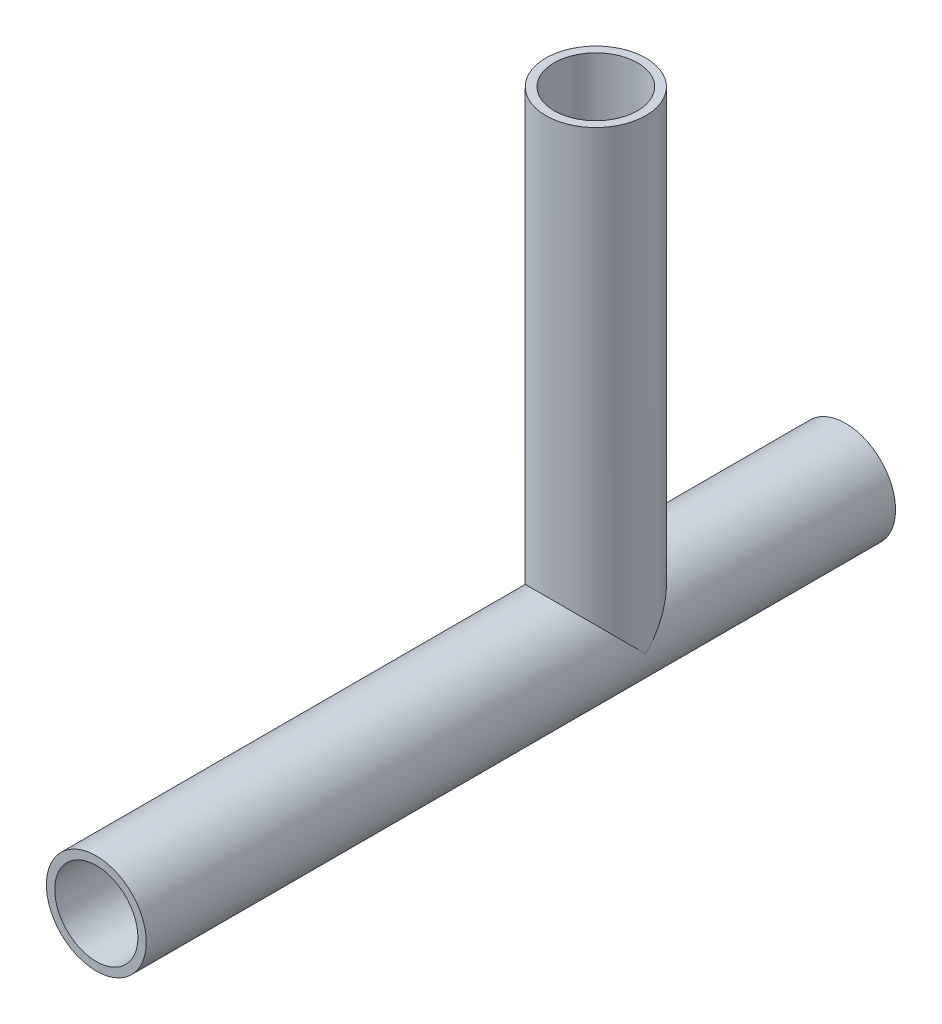
ISO-10303-21;
HEADER;
FILE_DESCRIPTION(('STEP AP214'),'2;1');
FILE_NAME('part.step','',(''),(''),'','','');
FILE_SCHEMA(('AUTOMOTIVE_DESIGN { 1 0 10303 214 1 1 1 1 }'));
ENDSEC;
DATA;
#1=APPLICATION_CONTEXT('core data for automotive mechanical design processes');
#2=APPLICATION_PROTOCOL_DEFINITION('international standard','automotive_design',2000,#1);
#3=PRODUCT_CONTEXT('',#1,'mechanical');
#4=PRODUCT('Part','Part','',(#3));
#5=PRODUCT_RELATED_PRODUCT_CATEGORY('part','',(#4));
#6=PRODUCT_DEFINITION_FORMATION('','',#4);
#7=PRODUCT_DEFINITION_CONTEXT('part definition',#1,'design');
#8=PRODUCT_DEFINITION('design','',#6,#7);
#9=PRODUCT_DEFINITION_SHAPE('','',#8);
#10=(LENGTH_UNIT() NAMED_UNIT(*) SI_UNIT(.MILLI.,.METRE.));
#11=(NAMED_UNIT(*) PLANE_ANGLE_UNIT() SI_UNIT($,.RADIAN.));
#12=(NAMED_UNIT(*) SI_UNIT($,.STERADIAN.) SOLID_ANGLE_UNIT());
#13=UNCERTAINTY_MEASURE_WITH_UNIT(LENGTH_MEASURE(1.E-05),#10,'distance_accuracy_value','');
#14=(GEOMETRIC_REPRESENTATION_CONTEXT(3) GLOBAL_UNCERTAINTY_ASSIGNED_CONTEXT((#13)) GLOBAL_UNIT_ASSIGNED_CONTEXT((#10,
#11,#12)) REPRESENTATION_CONTEXT('',''));
#15=CARTESIAN_POINT('',(0.,0.,0.));
#16=DIRECTION('',(0.,0.,1.));
#17=DIRECTION('',(1.,0.,0.));
#18=AXIS2_PLACEMENT_3D('',#15,#16,#17);
#19=CARTESIAN_POINT('',(0.,0.,-15.));
#20=DIRECTION('',(0.,0.,1.));
#21=DIRECTION('',(1.,0.,0.));
#22=AXIS2_PLACEMENT_3D('',#19,#20,#21);
#23=CYLINDRICAL_SURFACE('',#22,3.);
#24=CARTESIAN_POINT('',(0.,0.,-15.));
#25=DIRECTION('',(0.,0.,1.));
#26=DIRECTION('',(1.,0.,0.));
#27=AXIS2_PLACEMENT_3D('',#24,#25,#26);
#28=CIRCLE('',#27,3.);
#29=CARTESIAN_POINT('',(3.,0.,-15.));
#30=VERTEX_POINT('',#29);
#31=EDGE_CURVE('E185',#30,#30,#28,.T.);
#32=ORIENTED_EDGE('',*,*,#31,.T.);
#33=EDGE_LOOP('',(#32));
#34=FACE_BOUND('',#33,.T.);
#35=CARTESIAN_POINT('',(0.,0.,30.));
#36=DIRECTION('',(0.,0.,1.));
#37=DIRECTION('',(1.,0.,0.));
#38=AXIS2_PLACEMENT_3D('',#35,#36,#37);
#39=CIRCLE('',#38,3.);
#40=CARTESIAN_POINT('',(3.,0.,30.));
#41=VERTEX_POINT('',#40);
#42=EDGE_CURVE('E191',#41,#41,#39,.T.);
#43=ORIENTED_EDGE('',*,*,#42,.F.);
#44=EDGE_LOOP('',(#43));
#45=FACE_BOUND('',#44,.T.);
#46=CARTESIAN_POINT('',(0.,0.,0.));
#47=DIRECTION('',(0.,0.707106781186547,0.707106781186547));
#48=DIRECTION('',(0.,-0.707106781186547,0.707106781186547));
#49=AXIS2_PLACEMENT_3D('',#46,#47,#48);
#50=ELLIPSE('',#49,4.24264068711929,3.);
#51=CARTESIAN_POINT('',(-3.,0.,0.));
#52=VERTEX_POINT('',#51);
#53=CARTESIAN_POINT('',(3.,0.,0.));
#54=VERTEX_POINT('',#53);
#55=EDGE_CURVE('E102',#52,#54,#50,.F.);
#56=ORIENTED_EDGE('',*,*,#55,.T.);
#57=CARTESIAN_POINT('',(0.,0.,0.));
#58=DIRECTION('',(0.,-0.707106781186547,0.707106781186547));
#59=DIRECTION('',(0.,0.707106781186547,0.707106781186547));
#60=AXIS2_PLACEMENT_3D('',#57,#58,#59);
#61=ELLIPSE('',#60,4.24264068711929,3.);
#62=EDGE_CURVE('E196',#54,#52,#61,.T.);
#63=ORIENTED_EDGE('',*,*,#62,.T.);
#64=EDGE_LOOP('',(#56,#63));
#65=FACE_BOUND('',#64,.T.);
#66=ADVANCED_FACE('F37',(#34,#45,#65),#23,.T.);
#67=CARTESIAN_POINT('',(0.,0.,-15.));
#68=DIRECTION('',(0.,0.,1.));
#69=DIRECTION('',(1.,0.,0.));
#70=AXIS2_PLACEMENT_3D('',#67,#68,#69);
#71=CYLINDRICAL_SURFACE('',#70,2.5);
#72=CARTESIAN_POINT('',(0.,0.,30.));
#73=DIRECTION('',(0.,0.,1.));
#74=DIRECTION('',(1.,0.,0.));
#75=AXIS2_PLACEMENT_3D('',#72,#73,#74);
#76=CIRCLE('',#75,2.5);
#77=CARTESIAN_POINT('',(2.5,0.,30.));
#78=VERTEX_POINT('',#77);
#79=EDGE_CURVE('E194',#78,#78,#76,.T.);
#80=ORIENTED_EDGE('',*,*,#79,.T.);
#81=EDGE_LOOP('',(#80));
#82=FACE_BOUND('',#81,.T.);
#83=CARTESIAN_POINT('',(0.,0.,-15.));
#84=DIRECTION('',(0.,0.,1.));
#85=DIRECTION('',(1.,0.,0.));
#86=AXIS2_PLACEMENT_3D('',#83,#84,#85);
#87=CIRCLE('',#86,2.5);
#88=CARTESIAN_POINT('',(2.5,0.,-15.));
#89=VERTEX_POINT('',#88);
#90=EDGE_CURVE('E187',#89,#89,#87,.T.);
#91=ORIENTED_EDGE('',*,*,#90,.F.);
#92=EDGE_LOOP('',(#91));
#93=FACE_BOUND('',#92,.T.);
#94=DIRECTION('',(0.,0.,1.));
#95=VECTOR('',#94,1.);
#96=CARTESIAN_POINT('',(-2.5,0.,-15.));
#97=LINE('',#96,#95);
#98=CARTESIAN_POINT('',(-2.5,0.,1.6583123951777));
#99=VERTEX_POINT('',#98);
#100=CARTESIAN_POINT('',(-2.5,0.,0.));
#101=VERTEX_POINT('',#100);
#102=EDGE_CURVE('E53',#99,#101,#97,.F.);
#103=ORIENTED_EDGE('',*,*,#102,.F.);
#104=CARTESIAN_POINT('',(2.5,0.,1.6583123951777));
#105=CARTESIAN_POINT('',(2.50001053689097,0.0446676190961174,1.65828023930748));
#106=CARTESIAN_POINT('',(2.4988033626358,0.0893146756582219,1.6601162772629));
#107=CARTESIAN_POINT('',(2.49403945424107,0.178118808574985,1.66727317263237));
#108=CARTESIAN_POINT('',(2.49048724961452,0.222276662984987,1.6725873117957));
#109=CARTESIAN_POINT('',(2.48118723003889,0.309186552805187,1.68634898291668));
#110=CARTESIAN_POINT('',(2.47547237004126,0.351949707497475,1.69474943169534));
#111=CARTESIAN_POINT('',(2.46196831278083,0.436516845554949,1.71430901873713));
#112=CARTESIAN_POINT('',(2.4541779670438,0.478320283905698,1.72546968412582));
#113=CARTESIAN_POINT('',(2.42094569151119,0.634726425048235,1.77222694334976));
#114=CARTESIAN_POINT('',(2.38888265367656,0.745590990119838,1.81578246635464));
#115=CARTESIAN_POINT('',(2.31170305357439,0.958667215286052,1.91309058631365));
#116=CARTESIAN_POINT('',(2.26647787223489,1.06079733200858,1.96692669689499));
#117=CARTESIAN_POINT('',(2.17845139252837,1.22908717969094,2.06333806009316));
#118=CARTESIAN_POINT('',(2.13847839662809,1.2973472734266,2.10487744088079));
#119=CARTESIAN_POINT('',(2.05253160808425,1.42945216003762,2.18877312173696));
#120=CARTESIAN_POINT('',(2.00655528279991,1.49329507193548,2.23112976012053));
#121=CARTESIAN_POINT('',(1.85992335660289,1.67790046606017,2.3573792706994));
#122=CARTESIAN_POINT('',(1.75032166679402,1.79220223726546,2.4407338586886));
#123=CARTESIAN_POINT('',(1.53332316028444,1.9785848485795,2.5810766365136));
#124=CARTESIAN_POINT('',(1.43037180448632,2.05448117836856,2.63991085386502));
#125=CARTESIAN_POINT('',(1.21029935284124,2.19132333858638,2.74774689794262));
#126=CARTESIAN_POINT('',(1.09319843428571,2.25229009148164,2.79676246687922));
#127=CARTESIAN_POINT('',(0.867928883305876,2.3471135832324,2.87372981565162));
#128=CARTESIAN_POINT('',(0.761717046456604,2.38383517864742,2.90385830152503));
#129=CARTESIAN_POINT('',(0.542830448073846,2.44298114981978,2.95260444248338));
#130=CARTESIAN_POINT('',(0.430159668824189,2.46541423403497,2.9712291086228));
#131=CARTESIAN_POINT('',(0.200906226670691,2.49460149180071,2.99549159829453));
#132=CARTESIAN_POINT('',(0.0843091977674733,2.50128982658613,3.00107488681869));
#133=CARTESIAN_POINT('',(-0.148527340090233,2.49829775944192,2.99858143920542));
#134=CARTESIAN_POINT('',(-0.264766856743925,2.48861771252143,2.99050499932994));
#135=CARTESIAN_POINT('',(-0.485445759029511,2.45478579221322,2.96241339443721));
#136=CARTESIAN_POINT('',(-0.590153469719584,2.43164900062191,2.94323604357123));
#137=CARTESIAN_POINT('',(-0.793625750717623,2.37305235039454,2.89501327215416));
#138=CARTESIAN_POINT('',(-0.892389435591339,2.3375906611205,2.86596638567855));
#139=CARTESIAN_POINT('',(-1.09053416369652,2.25240860554024,2.79690287446883));
#140=CARTESIAN_POINT('',(-1.18924473934221,2.20172771983302,2.7561602110168));
#141=CARTESIAN_POINT('',(-1.3767800718126,2.08960269254213,2.66744714285834));
#142=CARTESIAN_POINT('',(-1.46559592577916,2.02814898391747,2.61947031903863));
#143=CARTESIAN_POINT('',(-1.67280362441445,1.86454080960494,2.49448801107939));
#144=CARTESIAN_POINT('',(-1.78517382835747,1.75692904106797,2.41452810108692));
#145=CARTESIAN_POINT('',(-1.93670155603639,1.58276013263235,2.29203972156859));
#146=CARTESIAN_POINT('',(-1.98442714978062,1.5224861962744,2.25072647403067));
#147=CARTESIAN_POINT('',(-2.07418686478911,1.39772822879842,2.16828385513607));
#148=CARTESIAN_POINT('',(-2.11622304065682,1.33324573004271,2.12715442261523));
#149=CARTESIAN_POINT('',(-2.21282190384309,1.16889290959051,2.02736668216148));
#150=CARTESIAN_POINT('',(-2.26406445132992,1.06656162182183,1.96949413582953));
#151=CARTESIAN_POINT('',(-2.35313154217164,0.852162280933765,1.86215058777702));
#152=CARTESIAN_POINT('',(-2.39099119237604,0.740120677710073,1.81265778441367));
#153=CARTESIAN_POINT('',(-2.44187928159532,0.542368123492129,1.7431252104005));
#154=CARTESIAN_POINT('',(-2.45896760338397,0.459278569532453,1.71871174214238));
#155=CARTESIAN_POINT('',(-2.48466533863309,0.289382777852356,1.68136078058063));
#156=CARTESIAN_POINT('',(-2.49330657445815,0.202591784872558,1.66838023493806));
#157=CARTESIAN_POINT('',(-2.49822814088172,0.0960725270432523,1.66098011654761));
#158=CARTESIAN_POINT('',(-2.49889195042314,0.0768814878014956,1.65998140373826));
#159=CARTESIAN_POINT('',(-2.49977745262101,0.0384623376736721,1.65864846758548));
#160=CARTESIAN_POINT('',(-2.49999905762164,0.0192342201937472,1.65831437598636));
#161=CARTESIAN_POINT('',(-2.5,0.,1.6583123951777));
#162=B_SPLINE_CURVE_WITH_KNOTS('',3,(#104,#105,#106,#107,#108,#109,#110,#111,#112,#113,#114,
#115,#116,#117,#118,#119,#120,#121,#122,#123,#124,#125,#126,#127,#128,#129,#130,#131,#132,#133,
#134,#135,#136,#137,#138,#139,#140,#141,#142,#143,#144,#145,#146,#147,#148,#149,#150,#151,#152,
#153,#154,#155,#156,#157,#158,#159,#160,#161),.UNSPECIFIED.,.F.,.F.,(4,2,2,2,2,2,2,2,2,2,2,2,2,
2,2,2,2,2,2,2,2,2,2,2,2,2,2,2,4),(0.,0.133915809511517,0.267573709534376,0.399271959248702,
0.531043236367036,0.898867426511474,1.26981755381915,1.53753000139769,1.8053557566704,
2.33924592067388,2.76010881123972,3.18037848070633,3.5279765341575,3.87536253284724,
4.22419861170398,4.57302712485181,4.89843954153485,5.22390031294721,5.57721326116425,
5.93084158108767,6.45264424433967,6.71427180911986,6.97580463953596,7.35949670871461,
7.74217465007991,8.00607441227289,8.26897611958203,8.32665105551862,8.38433742291033),.UNSPECIFIED.);
#163=CARTESIAN_POINT('',(2.5,0.,1.6583123951777));
#164=VERTEX_POINT('',#163);
#165=EDGE_CURVE('E42',#164,#99,#162,.T.);
#166=ORIENTED_EDGE('',*,*,#165,.F.);
#167=DIRECTION('',(0.,0.,1.));
#168=VECTOR('',#167,1.);
#169=CARTESIAN_POINT('',(2.5,0.,-15.));
#170=LINE('',#169,#168);
#171=CARTESIAN_POINT('',(2.5,0.,0.));
#172=VERTEX_POINT('',#171);
#173=EDGE_CURVE('E61',#172,#164,#170,.T.);
#174=ORIENTED_EDGE('',*,*,#173,.F.);
#175=CARTESIAN_POINT('',(2.5,0.,-1.6583123951777));
#176=VERTEX_POINT('',#175);
#177=EDGE_CURVE('E84',#176,#172,#170,.T.);
#178=ORIENTED_EDGE('',*,*,#177,.F.);
#179=CARTESIAN_POINT('',(-2.5,0.,-1.6583123951777));
#180=CARTESIAN_POINT('',(-2.50001053689097,0.0446676190961174,-1.65828023930748));
#181=CARTESIAN_POINT('',(-2.4988033626358,0.0893146756582219,-1.6601162772629));
#182=CARTESIAN_POINT('',(-2.49403945424107,0.178118808574985,-1.66727317263237));
#183=CARTESIAN_POINT('',(-2.49048724961452,0.222276662984987,-1.6725873117957));
#184=CARTESIAN_POINT('',(-2.48118723003889,0.309186552805187,-1.68634898291668));
#185=CARTESIAN_POINT('',(-2.47547237004126,0.351949707497475,-1.69474943169534));
#186=CARTESIAN_POINT('',(-2.46196831278083,0.436516845554949,-1.71430901873713));
#187=CARTESIAN_POINT('',(-2.4541779670438,0.478320283905698,-1.72546968412582));
#188=CARTESIAN_POINT('',(-2.42094569151119,0.634726425048235,-1.77222694334976));
#189=CARTESIAN_POINT('',(-2.38888265367656,0.745590990119838,-1.81578246635464));
#190=CARTESIAN_POINT('',(-2.31170305357439,0.958667215286052,-1.91309058631365));
#191=CARTESIAN_POINT('',(-2.26647787223489,1.06079733200858,-1.96692669689499));
#192=CARTESIAN_POINT('',(-2.17845139252837,1.22908717969094,-2.06333806009316));
#193=CARTESIAN_POINT('',(-2.13847839662809,1.2973472734266,-2.10487744088079));
#194=CARTESIAN_POINT('',(-2.05253160808425,1.42945216003762,-2.18877312173696));
#195=CARTESIAN_POINT('',(-2.00655528279991,1.49329507193548,-2.23112976012053));
#196=CARTESIAN_POINT('',(-1.85992335660289,1.67790046606017,-2.3573792706994));
#197=CARTESIAN_POINT('',(-1.75032166679402,1.79220223726546,-2.4407338586886));
#198=CARTESIAN_POINT('',(-1.53332316028444,1.9785848485795,-2.5810766365136));
#199=CARTESIAN_POINT('',(-1.43037180448632,2.05448117836856,-2.63991085386502));
#200=CARTESIAN_POINT('',(-1.21029935284124,2.19132333858638,-2.74774689794262));
#201=CARTESIAN_POINT('',(-1.09319843428571,2.25229009148164,-2.79676246687922));
#202=CARTESIAN_POINT('',(-0.867928883305876,2.3471135832324,-2.87372981565162));
#203=CARTESIAN_POINT('',(-0.761717046456604,2.38383517864742,-2.90385830152503));
#204=CARTESIAN_POINT('',(-0.542830448073846,2.44298114981978,-2.95260444248338));
#205=CARTESIAN_POINT('',(-0.430159668824189,2.46541423403497,-2.9712291086228));
#206=CARTESIAN_POINT('',(-0.200906226670691,2.49460149180071,-2.99549159829453));
#207=CARTESIAN_POINT('',(-0.0843091977674733,2.50128982658613,-3.00107488681869));
#208=CARTESIAN_POINT('',(0.148527340090233,2.49829775944192,-2.99858143920542));
#209=CARTESIAN_POINT('',(0.264766856743925,2.48861771252143,-2.99050499932994));
#210=CARTESIAN_POINT('',(0.485445759029511,2.45478579221322,-2.96241339443721));
#211=CARTESIAN_POINT('',(0.590153469719584,2.43164900062191,-2.94323604357123));
#212=CARTESIAN_POINT('',(0.793625750717623,2.37305235039454,-2.89501327215416));
#213=CARTESIAN_POINT('',(0.892389435591339,2.3375906611205,-2.86596638567855));
#214=CARTESIAN_POINT('',(1.09053416369652,2.25240860554024,-2.79690287446883));
#215=CARTESIAN_POINT('',(1.18924473934221,2.20172771983302,-2.7561602110168));
#216=CARTESIAN_POINT('',(1.3767800718126,2.08960269254213,-2.66744714285834));
#217=CARTESIAN_POINT('',(1.46559592577916,2.02814898391747,-2.61947031903863));
#218=CARTESIAN_POINT('',(1.67280362441445,1.86454080960494,-2.49448801107939));
#219=CARTESIAN_POINT('',(1.78517382835747,1.75692904106797,-2.41452810108692));
#220=CARTESIAN_POINT('',(1.93670155603639,1.58276013263235,-2.29203972156859));
#221=CARTESIAN_POINT('',(1.98442714978062,1.5224861962744,-2.25072647403067));
#222=CARTESIAN_POINT('',(2.07418686478911,1.39772822879842,-2.16828385513607));
#223=CARTESIAN_POINT('',(2.11622304065682,1.33324573004271,-2.12715442261523));
#224=CARTESIAN_POINT('',(2.21282190384309,1.16889290959051,-2.02736668216148));
#225=CARTESIAN_POINT('',(2.26406445132992,1.06656162182183,-1.96949413582953));
#226=CARTESIAN_POINT('',(2.35313154217164,0.852162280933765,-1.86215058777702));
#227=CARTESIAN_POINT('',(2.39099119237604,0.740120677710073,-1.81265778441367));
#228=CARTESIAN_POINT('',(2.44187928159532,0.542368123492129,-1.7431252104005));
#229=CARTESIAN_POINT('',(2.45896760338397,0.459278569532453,-1.71871174214238));
#230=CARTESIAN_POINT('',(2.48466533863309,0.289382777852356,-1.68136078058063));
#231=CARTESIAN_POINT('',(2.49330657445815,0.202591784872558,-1.66838023493806));
#232=CARTESIAN_POINT('',(2.49822814088172,0.0960725270432523,-1.66098011654761));
#233=CARTESIAN_POINT('',(2.49889195042314,0.0768814878014956,-1.65998140373826));
#234=CARTESIAN_POINT('',(2.49977745262101,0.0384623376736721,-1.65864846758548));
#235=CARTESIAN_POINT('',(2.49999905762164,0.0192342201937472,-1.65831437598636));
#236=CARTESIAN_POINT('',(2.5,0.,-1.6583123951777));
#237=B_SPLINE_CURVE_WITH_KNOTS('',3,(#179,#180,#181,#182,#183,#184,#185,#186,#187,#188,#189,
#190,#191,#192,#193,#194,#195,#196,#197,#198,#199,#200,#201,#202,#203,#204,#205,#206,#207,#208,
#209,#210,#211,#212,#213,#214,#215,#216,#217,#218,#219,#220,#221,#222,#223,#224,#225,#226,#227,
#228,#229,#230,#231,#232,#233,#234,#235,#236),.UNSPECIFIED.,.F.,.F.,(4,2,2,2,2,2,2,2,2,2,2,2,2,
2,2,2,2,2,2,2,2,2,2,2,2,2,2,2,4),(0.,0.133915809511517,0.267573709534376,0.399271959248702,
0.531043236367036,0.898867426511474,1.26981755381915,1.53753000139769,1.8053557566704,
2.33924592067388,2.76010881123972,3.18037848070633,3.5279765341575,3.87536253284724,
4.22419861170398,4.57302712485181,4.89843954153485,5.22390031294721,5.57721326116425,
5.93084158108767,6.45264424433967,6.71427180911986,6.97580463953596,7.35949670871461,
7.74217465007991,8.00607441227289,8.26897611958203,8.32665105551862,8.38433742291033),.UNSPECIFIED.);
#238=CARTESIAN_POINT('',(-2.5,0.,-1.6583123951777));
#239=VERTEX_POINT('',#238);
#240=EDGE_CURVE('E87',#239,#176,#237,.T.);
#241=ORIENTED_EDGE('',*,*,#240,.F.);
#242=EDGE_CURVE('E68',#101,#239,#97,.F.);
#243=ORIENTED_EDGE('',*,*,#242,.F.);
#244=EDGE_LOOP('',(#103,#166,#174,#178,#241,#243));
#245=FACE_BOUND('',#244,.T.);
#246=ADVANCED_FACE('F86',(#82,#93,#245),#71,.F.);
#247=CARTESIAN_POINT('',(0.,0.,-15.));
#248=DIRECTION('',(0.,0.,1.));
#249=DIRECTION('',(1.,0.,0.));
#250=AXIS2_PLACEMENT_3D('',#247,#248,#249);
#251=PLANE('',#250);
#252=ORIENTED_EDGE('',*,*,#90,.T.);
#253=EDGE_LOOP('',(#252));
#254=FACE_BOUND('',#253,.T.);
#255=ORIENTED_EDGE('',*,*,#31,.F.);
#256=EDGE_LOOP('',(#255));
#257=FACE_BOUND('',#256,.T.);
#258=ADVANCED_FACE('F144',(#254,#257),#251,.F.);
#259=CARTESIAN_POINT('',(0.,0.,30.));
#260=DIRECTION('',(0.,0.,1.));
#261=DIRECTION('',(1.,0.,0.));
#262=AXIS2_PLACEMENT_3D('',#259,#260,#261);
#263=PLANE('',#262);
#264=ORIENTED_EDGE('',*,*,#42,.T.);
#265=EDGE_LOOP('',(#264));
#266=FACE_BOUND('',#265,.T.);
#267=ORIENTED_EDGE('',*,*,#79,.F.);
#268=EDGE_LOOP('',(#267));
#269=FACE_BOUND('',#268,.T.);
#270=ADVANCED_FACE('F133',(#266,#269),#263,.T.);
#271=CARTESIAN_POINT('',(0.,28.,0.));
#272=DIRECTION('',(0.,-1.,0.));
#273=DIRECTION('',(0.,0.,-1.));
#274=AXIS2_PLACEMENT_3D('',#271,#272,#273);
#275=CYLINDRICAL_SURFACE('',#274,3.);
#276=CARTESIAN_POINT('',(0.,0.,0.));
#277=DIRECTION('',(0.,1.,0.));
#278=DIRECTION('',(0.,0.,1.));
#279=AXIS2_PLACEMENT_3D('',#276,#277,#278);
#280=CIRCLE('',#279,3.);
#281=EDGE_CURVE('E96',#176,#239,#280,.T.);
#282=ORIENTED_EDGE('',*,*,#281,.T.);
#283=ORIENTED_EDGE('',*,*,#240,.T.);
#284=EDGE_LOOP('',(#282,#283));
#285=FACE_BOUND('',#284,.T.);
#286=ADVANCED_FACE('F95',(#285),#275,.T.);
#287=CARTESIAN_POINT('',(0.,28.,0.));
#288=DIRECTION('',(0.,-1.,0.));
#289=DIRECTION('',(0.,0.,-1.));
#290=AXIS2_PLACEMENT_3D('',#287,#288,#289);
#291=CYLINDRICAL_SURFACE('',#290,2.5);
#292=CARTESIAN_POINT('',(0.,0.,0.));
#293=DIRECTION('',(0.,0.707106781186547,0.707106781186547));
#294=DIRECTION('',(0.,-0.707106781186547,0.707106781186547));
#295=AXIS2_PLACEMENT_3D('',#292,#293,#294);
#296=ELLIPSE('',#295,3.53553390593274,2.5);
#297=EDGE_CURVE('E182',#101,#172,#296,.F.);
#298=ORIENTED_EDGE('',*,*,#297,.F.);
#299=CARTESIAN_POINT('',(0.,0.,0.));
#300=DIRECTION('',(0.,1.,0.));
#301=DIRECTION('',(0.,0.,1.));
#302=AXIS2_PLACEMENT_3D('',#299,#300,#301);
#303=CIRCLE('',#302,2.5);
#304=EDGE_CURVE('E171',#172,#101,#303,.T.);
#305=ORIENTED_EDGE('',*,*,#304,.F.);
#306=EDGE_LOOP('',(#298,#305));
#307=FACE_BOUND('',#306,.T.);
#308=ADVANCED_FACE('F120',(#307),#291,.F.);
#309=CARTESIAN_POINT('',(0.,0.,0.));
#310=DIRECTION('',(0.,1.,0.));
#311=DIRECTION('',(0.,0.,1.));
#312=AXIS2_PLACEMENT_3D('',#309,#310,#311);
#313=PLANE('',#312);
#314=ORIENTED_EDGE('',*,*,#304,.T.);
#315=ORIENTED_EDGE('',*,*,#242,.T.);
#316=ORIENTED_EDGE('',*,*,#281,.F.);
#317=ORIENTED_EDGE('',*,*,#177,.T.);
#318=EDGE_LOOP('',(#314,#315,#316,#317));
#319=FACE_BOUND('',#318,.T.);
#320=ADVANCED_FACE('F97',(#319),#313,.F.);
#321=CARTESIAN_POINT('',(0.,0.,0.));
#322=DIRECTION('',(0.,-0.707106781186547,0.707106781186547));
#323=DIRECTION('',(0.,0.707106781186547,0.707106781186547));
#324=AXIS2_PLACEMENT_3D('',#321,#322,#323);
#325=ELLIPSE('',#324,3.53553390593274,2.5);
#326=EDGE_CURVE('E181',#172,#101,#325,.T.);
#327=ORIENTED_EDGE('',*,*,#326,.F.);
#328=EDGE_CURVE('E173',#101,#172,#303,.T.);
#329=ORIENTED_EDGE('',*,*,#328,.F.);
#330=EDGE_LOOP('',(#327,#329));
#331=FACE_BOUND('',#330,.T.);
#332=ADVANCED_FACE('F119',(#331),#291,.F.);
#333=EDGE_CURVE('E99',#99,#164,#280,.T.);
#334=ORIENTED_EDGE('',*,*,#333,.T.);
#335=ORIENTED_EDGE('',*,*,#165,.T.);
#336=EDGE_LOOP('',(#334,#335));
#337=FACE_BOUND('',#336,.T.);
#338=ADVANCED_FACE('F127',(#337),#275,.T.);
#339=ORIENTED_EDGE('',*,*,#333,.F.);
#340=ORIENTED_EDGE('',*,*,#102,.T.);
#341=ORIENTED_EDGE('',*,*,#328,.T.);
#342=ORIENTED_EDGE('',*,*,#173,.T.);
#343=EDGE_LOOP('',(#339,#340,#341,#342));
#344=FACE_BOUND('',#343,.T.);
#345=ADVANCED_FACE('F124',(#344),#313,.F.);
#346=CARTESIAN_POINT('',(0.,28.,0.));
#347=DIRECTION('',(0.,1.,0.));
#348=DIRECTION('',(0.,0.,1.));
#349=AXIS2_PLACEMENT_3D('',#346,#347,#348);
#350=PLANE('',#349);
#351=CARTESIAN_POINT('',(0.,28.,0.));
#352=DIRECTION('',(0.,1.,0.));
#353=DIRECTION('',(0.,0.,1.));
#354=AXIS2_PLACEMENT_3D('',#351,#352,#353);
#355=CIRCLE('',#354,3.);
#356=CARTESIAN_POINT('',(0.,28.,3.));
#357=VERTEX_POINT('',#356);
#358=EDGE_CURVE('E98',#357,#357,#355,.T.);
#359=ORIENTED_EDGE('',*,*,#358,.T.);
#360=EDGE_LOOP('',(#359));
#361=FACE_BOUND('',#360,.T.);
#362=CARTESIAN_POINT('',(0.,28.,0.));
#363=DIRECTION('',(0.,1.,0.));
#364=DIRECTION('',(0.,0.,1.));
#365=AXIS2_PLACEMENT_3D('',#362,#363,#364);
#366=CIRCLE('',#365,2.5);
#367=CARTESIAN_POINT('',(0.,28.,2.5));
#368=VERTEX_POINT('',#367);
#369=EDGE_CURVE('E105',#368,#368,#366,.T.);
#370=ORIENTED_EDGE('',*,*,#369,.F.);
#371=EDGE_LOOP('',(#370));
#372=FACE_BOUND('',#371,.T.);
#373=ADVANCED_FACE('F121',(#361,#372),#350,.T.);
#374=ORIENTED_EDGE('',*,*,#62,.F.);
#375=ORIENTED_EDGE('',*,*,#55,.F.);
#376=EDGE_LOOP('',(#374,#375));
#377=FACE_BOUND('',#376,.T.);
#378=ORIENTED_EDGE('',*,*,#358,.F.);
#379=EDGE_LOOP('',(#378));
#380=FACE_BOUND('',#379,.T.);
#381=ADVANCED_FACE('F117',(#377,#380),#275,.T.);
#382=CARTESIAN_POINT('',(0.,3.,-2.5));
#383=CARTESIAN_POINT('',(0.118757533193203,2.99999522795205,-2.49999511444632));
#384=CARTESIAN_POINT('',(0.237551281104128,2.99288670594742,-2.49147749609542));
#385=CARTESIAN_POINT('',(0.471182492492811,2.96510762868268,-2.45803727664817));
#386=CARTESIAN_POINT('',(0.586016959612417,2.94442702942007,-2.43310252602469));
#387=CARTESIAN_POINT('',(0.807829942407298,2.89142690238865,-2.36868788266729));
#388=CARTESIAN_POINT('',(0.914850920904902,2.8591769655007,-2.32929492564629));
#389=CARTESIAN_POINT('',(1.11984139043408,2.78529176182903,-2.23798295205742));
#390=CARTESIAN_POINT('',(1.21780780775233,2.74365332434937,-2.18605970332675));
#391=CARTESIAN_POINT('',(1.43789998519767,2.63674191529867,-2.05054625019185));
#392=CARTESIAN_POINT('',(1.5556821965722,2.56840549256191,-1.96232979581782));
#393=CARTESIAN_POINT('',(1.77202398328147,2.42422624777674,-1.76947567424863));
#394=CARTESIAN_POINT('',(1.87052845158605,2.34836281453276,-1.66479243075689));
#395=CARTESIAN_POINT('',(2.00437263805589,2.23294886313738,-1.49591572350891));
#396=CARTESIAN_POINT('',(2.04699726278816,2.19383679994997,-1.4370444238087));
#397=CARTESIAN_POINT('',(2.12715295529554,2.11620611809193,-1.3154943970395));
#398=CARTESIAN_POINT('',(2.16468231743739,2.07768770195023,-1.25281440512926));
#399=CARTESIAN_POINT('',(2.23441122570746,2.00250543288661,-1.12373267566439));
#400=CARTESIAN_POINT('',(2.26662332666227,1.96583735754651,-1.05734021527518));
#401=CARTESIAN_POINT('',(2.32553690612792,1.89577686630311,-0.920553716071608));
#402=CARTESIAN_POINT('',(2.3522430799868,1.86238167220904,-0.850163152658206));
#403=CARTESIAN_POINT('',(2.40193513934005,1.79791918980412,-0.698332909799901));
#404=CARTESIAN_POINT('',(2.42433807692598,1.76736311251003,-0.61647590727652));
#405=CARTESIAN_POINT('',(2.46101313675502,1.71593180556003,-0.448110231186899));
#406=CARTESIAN_POINT('',(2.47530499393792,1.69503310194197,-0.361613413385327));
#407=CARTESIAN_POINT('',(2.49481072799048,1.66620928968844,-0.184234591620547));
#408=CARTESIAN_POINT('',(2.49991205058667,1.65844510563093,-0.0933120409293098));
#409=CARTESIAN_POINT('',(2.5000856937119,1.65818308531825,0.0885626130027593));
#410=CARTESIAN_POINT('',(2.49515788278405,1.6656854491694,0.179514716615333));
#411=CARTESIAN_POINT('',(2.47505262029594,1.69541639464497,0.365524710827117));
#412=CARTESIAN_POINT('',(2.45905577113332,1.71881932066467,0.460293745717061));
#413=CARTESIAN_POINT('',(2.41742550503027,1.77688235738914,0.644210981202171));
#414=CARTESIAN_POINT('',(2.39176011044289,1.81157977103025,0.733339370714818));
#415=CARTESIAN_POINT('',(2.33816270346873,1.88002226126137,0.887827078541099));
#416=CARTESIAN_POINT('',(2.31177513033566,1.91250316845439,0.954312242411649));
#417=CARTESIAN_POINT('',(2.25404424958636,1.98021996661529,1.08365080677993));
#418=CARTESIAN_POINT('',(2.22269803586306,2.01545746697786,1.14650204786584));
#419=CARTESIAN_POINT('',(2.12149677560466,2.12342648109725,1.32996684101967));
#420=CARTESIAN_POINT('',(2.04450664231777,2.19837696967438,1.44541414760608));
#421=CARTESIAN_POINT('',(1.86765914501414,2.35079897952278,1.66826696245435));
#422=CARTESIAN_POINT('',(1.76681805277628,2.42819792618945,1.77493832399189));
#423=CARTESIAN_POINT('',(1.54484388336149,2.57509054043285,1.9711123448174));
#424=CARTESIAN_POINT('',(1.42375565615773,2.64460112267364,2.06065203305626));
#425=CARTESIAN_POINT('',(1.19411179169416,2.75428914126547,2.19941483909855));
#426=CARTESIAN_POINT('',(1.08972732107277,2.79748350073995,2.25314289818765));
#427=CARTESIAN_POINT('',(0.871071458330366,2.87307804019801,2.34634274525534));
#428=CARTESIAN_POINT('',(0.756806292780762,2.90548495660805,2.38582343158057));
#429=CARTESIAN_POINT('',(0.519954301215418,2.95709834265565,2.4484172499322));
#430=CARTESIAN_POINT('',(0.397310923125308,2.97620280955844,2.47140394665756));
#431=CARTESIAN_POINT('',(0.148559976923726,2.99891434528972,2.49870923192719));
#432=CARTESIAN_POINT('',(0.0224547835240014,3.00253178304177,2.50304031085016));
#433=CARTESIAN_POINT('',(-0.213310199456576,2.99444999039147,2.49333756055624));
#434=CARTESIAN_POINT('',(-0.323130540835861,2.98453350716313,2.48144136128483));
#435=CARTESIAN_POINT('',(-0.538644964400606,2.95325589460135,2.44373304978851));
#436=CARTESIAN_POINT('',(-0.644338549989563,2.93189339242796,2.41791926828104));
#437=CARTESIAN_POINT('',(-0.850565499199257,2.87889521546186,2.35337660454474));
#438=CARTESIAN_POINT('',(-0.951010682223316,2.84712564891974,2.31447921055573));
#439=CARTESIAN_POINT('',(-1.14365900898104,2.77536124733889,2.2256043676633));
#440=CARTESIAN_POINT('',(-1.2358590883121,2.73536337221808,2.17562282300671));
#441=CARTESIAN_POINT('',(-1.45067439735099,2.62975152158594,2.04156820465303));
#442=CARTESIAN_POINT('',(-1.56834359540731,2.56070244234714,1.9522674167327));
#443=CARTESIAN_POINT('',(-1.78428994740848,2.41522445403191,1.75715961734437));
#444=CARTESIAN_POINT('',(-1.88250490855173,2.33877300422835,1.65130154464526));
#445=CARTESIAN_POINT('',(-2.01573314784291,2.222698055986,1.48058803207139));
#446=CARTESIAN_POINT('',(-2.05811069143949,2.1834115173603,1.42110172702401));
#447=CARTESIAN_POINT('',(-2.13771669597406,2.10553153817181,1.29827918396772));
#448=CARTESIAN_POINT('',(-2.17494330406755,2.06693835133607,1.2349415723359));
#449=CARTESIAN_POINT('',(-2.24398857026757,1.99176108482639,1.10451159608481));
#450=CARTESIAN_POINT('',(-2.27582148781538,1.95517188634212,1.03742977546639));
#451=CARTESIAN_POINT('',(-2.3338885673946,1.88547561448179,0.89920989550017));
#452=CARTESIAN_POINT('',(-2.36012785984655,1.8523653645079,0.828075629580629));
#453=CARTESIAN_POINT('',(-2.40837357148322,1.78925557416047,0.675729631648114));
#454=CARTESIAN_POINT('',(-2.42988314318545,1.75970711786653,0.594165548926274));
#455=CARTESIAN_POINT('',(-2.46482255689514,1.71043063887427,0.426548046057394));
#456=CARTESIAN_POINT('',(-2.47827257713357,1.69067811225259,0.340506428672119));
#457=CARTESIAN_POINT('',(-2.49617289535263,1.6641531597946,0.164362392587668));
#458=CARTESIAN_POINT('',(-2.5005179918396,1.65753251048391,0.0742246702493129));
#459=CARTESIAN_POINT('',(-2.49938197104455,1.65924308630667,-0.105853212783938));
#460=CARTESIAN_POINT('',(-2.49389826274012,1.66757825402155,-0.195793315125139));
#461=CARTESIAN_POINT('',(-2.47265263848541,1.69892898735519,-0.381672575390522));
#462=CARTESIAN_POINT('',(-2.45585812550761,1.72341371023858,-0.477230270532679));
#463=CARTESIAN_POINT('',(-2.41250339675091,1.78358728037387,-0.662531296082707));
#464=CARTESIAN_POINT('',(-2.38591088285909,1.81931312531326,-0.752254228709298));
#465=CARTESIAN_POINT('',(-2.33050835844919,1.88952619366194,-0.907789041354843));
#466=CARTESIAN_POINT('',(-2.30325853049531,1.92277816627791,-0.974743759234923));
#467=CARTESIAN_POINT('',(-2.24370627018012,1.99195185230571,-1.1049463864244));
#468=CARTESIAN_POINT('',(-2.21140090020864,2.0278751115052,-1.16819211099982));
#469=CARTESIAN_POINT('',(-2.10716294428985,2.13775931167912,-1.35272956134196));
#470=CARTESIAN_POINT('',(-2.02793576743751,2.2137978016432,-1.46874692499193));
#471=CARTESIAN_POINT('',(-1.84629697567414,2.36772603763546,-1.69200726129125));
#472=CARTESIAN_POINT('',(-1.7429395959328,2.44552394429512,-1.79854179403293));
#473=CARTESIAN_POINT('',(-1.51553554935621,2.59256498427755,-1.99386379953934));
#474=CARTESIAN_POINT('',(-1.39153583663215,2.66182692543068,-2.08269056587395));
#475=CARTESIAN_POINT('',(-1.15855518141083,2.76942305781508,-2.21831419672309));
#476=CARTESIAN_POINT('',(-1.05399877947693,2.81112174006883,-2.27003851021944));
#477=CARTESIAN_POINT('',(-0.835439786054358,2.88361460666452,-2.35921867023858));
#478=CARTESIAN_POINT('',(-0.721450026753904,2.9144233132377,-2.39669352409529));
#479=CARTESIAN_POINT('',(-0.506620038886858,2.9585874590469,-2.45018845582659));
#480=CARTESIAN_POINT('',(-0.406845468761924,2.97402142398111,-2.46877512222678));
#481=CARTESIAN_POINT('',(-0.204722725654237,2.99472922794408,-2.49368236823808));
#482=CARTESIAN_POINT('',(-0.102374818922784,3.00000411373941,-2.50000421158692));
#483=CARTESIAN_POINT('',(0.,3.,-2.5));
#484=B_SPLINE_CURVE_WITH_KNOTS('',3,(#382,#383,#384,#385,#386,#387,#388,#389,#390,#391,#392,
#393,#394,#395,#396,#397,#398,#399,#400,#401,#402,#403,#404,#405,#406,#407,#408,#409,#410,#411,
#412,#413,#414,#415,#416,#417,#418,#419,#420,#421,#422,#423,#424,#425,#426,#427,#428,#429,#430,
#431,#432,#433,#434,#435,#436,#437,#438,#439,#440,#441,#442,#443,#444,#445,#446,#447,#448,#449,
#450,#451,#452,#453,#454,#455,#456,#457,#458,#459,#460,#461,#462,#463,#464,#465,#466,#467,#468,
#469,#470,#471,#472,#473,#474,#475,#476,#477,#478,#479,#480,#481,#482,#483),.UNSPECIFIED.,.T.,
.F.,(4,2,2,2,2,2,2,2,2,2,2,2,2,2,2,2,2,2,2,2,2,2,2,2,2,2,2,2,2,2,2,2,2,2,2,2,2,2,2,2,2,2,2,2,2,
2,2,2,2,2,4),(0.,0.355841276815113,0.711946191026961,1.06594405359551,1.42006164830116,
1.90425178760126,2.38980643116775,2.63722280423449,2.88472179650724,3.13162777943676,
3.37832232674674,3.64812890035755,3.9172761661687,4.18969776924975,4.46212294312047,
4.75723524199722,5.05333228584568,5.28870178855694,5.52420974868633,5.9954933935898,
6.49137310548271,6.98616858956867,7.36002155957576,7.73364063000476,8.11009395319721,
8.48629519274361,8.81743460677927,9.14861374669872,9.48423297747607,9.81997643164434,
10.3065635514456,10.7946819775667,11.0432812121088,11.2919696391639,11.5399899810636,
11.787781852862,12.0551105531685,12.3217671309317,12.5914881373799,12.8612802568452,
13.1598101383752,13.4593330283462,13.6977271411687,13.9362602949129,14.4135864576438,
14.914300110886,15.413889999571,15.7841228897598,16.1538601797496,16.4606444271243,
16.7673970625124),.UNSPECIFIED.);
#485=CARTESIAN_POINT('',(0.,3.,-2.5));
#486=VERTEX_POINT('',#485);
#487=EDGE_CURVE('E11',#486,#486,#484,.T.);
#488=ORIENTED_EDGE('',*,*,#487,.T.);
#489=EDGE_LOOP('',(#488));
#490=FACE_BOUND('',#489,.T.);
#491=ORIENTED_EDGE('',*,*,#369,.T.);
#492=EDGE_LOOP('',(#491));
#493=FACE_BOUND('',#492,.T.);
#494=ADVANCED_FACE('F113',(#490,#493),#291,.F.);
#495=ORIENTED_EDGE('',*,*,#487,.F.);
#496=EDGE_LOOP('',(#495));
#497=FACE_BOUND('',#496,.T.);
#498=ADVANCED_FACE('F39',(#497),#23,.T.);
#499=ORIENTED_EDGE('',*,*,#297,.T.);
#500=ORIENTED_EDGE('',*,*,#326,.T.);
#501=EDGE_LOOP('',(#499,#500));
#502=FACE_BOUND('',#501,.T.);
#503=ADVANCED_FACE('F140',(#502),#71,.F.);
#504=CLOSED_SHELL('',(#66,#246,#258,#270,#286,#308,#320,#332,#338,#345,#373,#381,#494,#498,#503));
#505=MANIFOLD_SOLID_BREP('B2',#504);
#506=ADVANCED_BREP_SHAPE_REPRESENTATION('',(#18,#505),#14);
#507=SHAPE_DEFINITION_REPRESENTATION(#9,#506);
ENDSEC;
END-ISO-10303-21;
